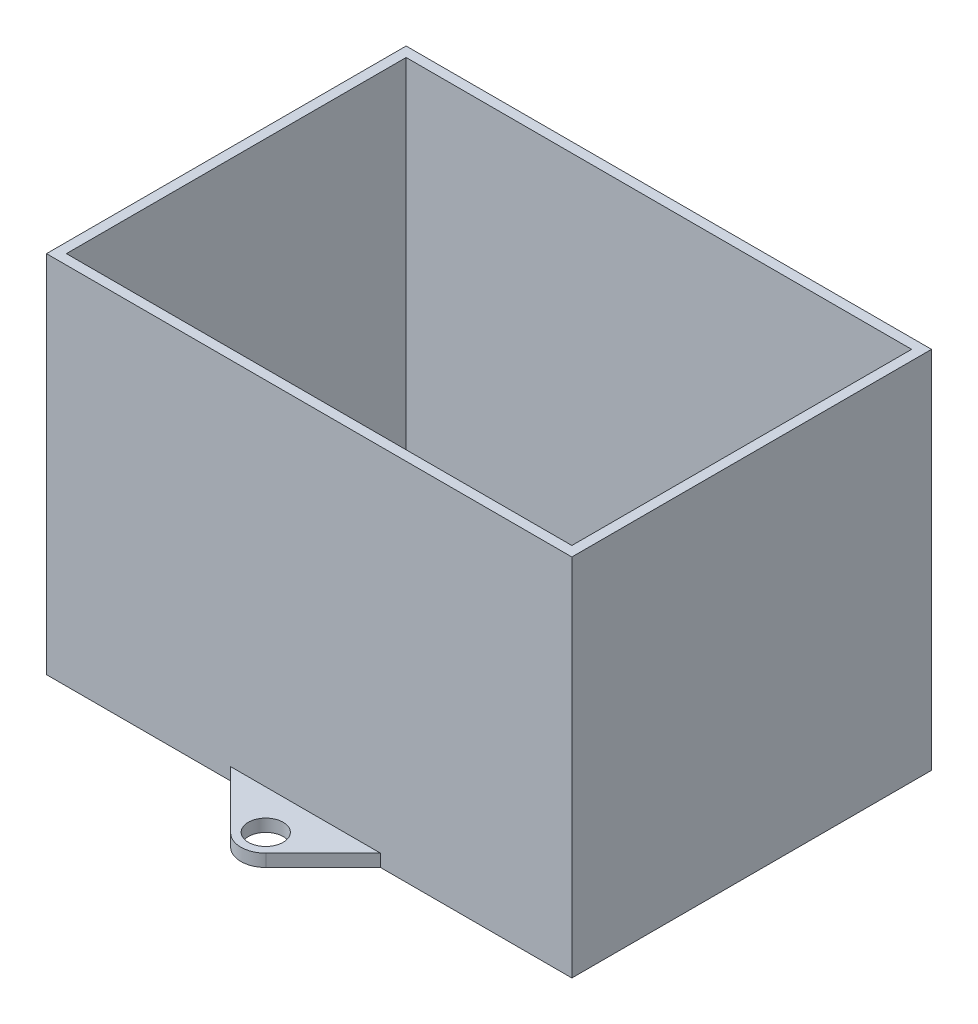
ISO-10303-21;
HEADER;
FILE_DESCRIPTION(('STEP AP214'),'2;1');
FILE_NAME('part.step','',(''),(''),'','','');
FILE_SCHEMA(('AUTOMOTIVE_DESIGN { 1 0 10303 214 1 1 1 1 }'));
ENDSEC;
DATA;
#1=APPLICATION_CONTEXT('core data for automotive mechanical design processes');
#2=APPLICATION_PROTOCOL_DEFINITION('international standard','automotive_design',2000,#1);
#3=PRODUCT_CONTEXT('',#1,'mechanical');
#4=PRODUCT('Part','Part','',(#3));
#5=PRODUCT_RELATED_PRODUCT_CATEGORY('part','',(#4));
#6=PRODUCT_DEFINITION_FORMATION('','',#4);
#7=PRODUCT_DEFINITION_CONTEXT('part definition',#1,'design');
#8=PRODUCT_DEFINITION('design','',#6,#7);
#9=PRODUCT_DEFINITION_SHAPE('','',#8);
#10=(LENGTH_UNIT() NAMED_UNIT(*) SI_UNIT(.MILLI.,.METRE.));
#11=(NAMED_UNIT(*) PLANE_ANGLE_UNIT() SI_UNIT($,.RADIAN.));
#12=(NAMED_UNIT(*) SI_UNIT($,.STERADIAN.) SOLID_ANGLE_UNIT());
#13=UNCERTAINTY_MEASURE_WITH_UNIT(LENGTH_MEASURE(1.E-05),#10,'distance_accuracy_value','');
#14=(GEOMETRIC_REPRESENTATION_CONTEXT(3) GLOBAL_UNCERTAINTY_ASSIGNED_CONTEXT((#13)) GLOBAL_UNIT_ASSIGNED_CONTEXT((#10,
#11,#12)) REPRESENTATION_CONTEXT('',''));
#15=CARTESIAN_POINT('',(0.,0.,0.));
#16=DIRECTION('',(0.,0.,1.));
#17=DIRECTION('',(1.,0.,0.));
#18=AXIS2_PLACEMENT_3D('',#15,#16,#17);
#19=CARTESIAN_POINT('',(0.,0.,0.));
#20=DIRECTION('',(0.,1.,0.));
#21=DIRECTION('',(0.,0.,1.));
#22=AXIS2_PLACEMENT_3D('',#19,#20,#21);
#23=PLANE('',#22);
#24=DIRECTION('',(0.,0.,-1.));
#25=VECTOR('',#24,1.);
#26=CARTESIAN_POINT('',(61.,0.,0.));
#27=LINE('',#26,#25);
#28=CARTESIAN_POINT('',(61.,0.,0.));
#29=VERTEX_POINT('',#28);
#30=CARTESIAN_POINT('',(61.,0.,-41.));
#31=VERTEX_POINT('',#30);
#32=EDGE_CURVE('E269',#29,#31,#27,.T.);
#33=ORIENTED_EDGE('',*,*,#32,.T.);
#34=DIRECTION('',(1.,0.,0.));
#35=VECTOR('',#34,1.);
#36=CARTESIAN_POINT('',(0.,0.,-41.));
#37=LINE('',#36,#35);
#38=CARTESIAN_POINT('',(0.,0.,-41.));
#39=VERTEX_POINT('',#38);
#40=EDGE_CURVE('E300',#39,#31,#37,.T.);
#41=ORIENTED_EDGE('',*,*,#40,.F.);
#42=DIRECTION('',(0.,0.,-1.));
#43=VECTOR('',#42,1.);
#44=CARTESIAN_POINT('',(0.,0.,0.));
#45=LINE('',#44,#43);
#46=CARTESIAN_POINT('',(0.,0.,0.));
#47=VERTEX_POINT('',#46);
#48=EDGE_CURVE('E298',#47,#39,#45,.T.);
#49=ORIENTED_EDGE('',*,*,#48,.F.);
#50=DIRECTION('',(1.,0.,0.));
#51=VECTOR('',#50,1.);
#52=CARTESIAN_POINT('',(0.,0.,0.));
#53=LINE('',#52,#51);
#54=EDGE_CURVE('E295',#47,#29,#53,.T.);
#55=ORIENTED_EDGE('',*,*,#54,.T.);
#56=EDGE_LOOP('',(#33,#41,#49,#55));
#57=FACE_BOUND('',#56,.T.);
#58=CARTESIAN_POINT('',(29.9999999999999,0.,5.93903508848857));
#59=DIRECTION('',(0.,1.,0.));
#60=DIRECTION('',(0.,0.,1.));
#61=AXIS2_PLACEMENT_3D('',#58,#59,#60);
#62=CIRCLE('',#61,2.1);
#63=CARTESIAN_POINT('',(29.9999999999999,0.,8.03903508848857));
#64=VERTEX_POINT('',#63);
#65=EDGE_CURVE('E628',#64,#64,#62,.T.);
#66=ORIENTED_EDGE('',*,*,#65,.T.);
#67=EDGE_LOOP('',(#66));
#68=FACE_BOUND('',#67,.T.);
#69=CARTESIAN_POINT('',(-19.4975103653291,0.,-43.5584039122733));
#70=DIRECTION('',(0.,1.,0.));
#71=DIRECTION('',(0.,0.,1.));
#72=AXIS2_PLACEMENT_3D('',#69,#70,#71);
#73=CIRCLE('',#72,2.1);
#74=CARTESIAN_POINT('',(-19.4975103653291,0.,-41.4584039122733));
#75=VERTEX_POINT('',#74);
#76=EDGE_CURVE('E378',#75,#75,#73,.T.);
#77=ORIENTED_EDGE('',*,*,#76,.T.);
#78=EDGE_LOOP('',(#77));
#79=FACE_BOUND('',#78,.T.);
#80=CARTESIAN_POINT('',(-19.4975103653291,0.,-43.5584039122733));
#81=DIRECTION('',(0.,1.,0.));
#82=DIRECTION('',(0.,0.,1.));
#83=AXIS2_PLACEMENT_3D('',#80,#81,#82);
#84=CIRCLE('',#83,3.);
#85=CARTESIAN_POINT('',(-21.618832238129,-1.14491749414469E-13,-45.6797227265917));
#86=VERTEX_POINT('',#85);
#87=CARTESIAN_POINT('',(-21.6188291796475,0.,-41.4370820394735));
#88=VERTEX_POINT('',#87);
#89=EDGE_CURVE('E208',#86,#88,#84,.T.);
#90=ORIENTED_EDGE('',*,*,#89,.F.);
#91=DIRECTION('',(0.707106271439455,0.,-0.707107290933272));
#92=VECTOR('',#91,1.);
#93=CARTESIAN_POINT('',(-33.649293067158,-2.16572091337908E-13,-33.6492445522485));
#94=LINE('',#93,#92);
#95=CARTESIAN_POINT('',(-13.1492922021107,-2.11744053343235E-13,-54.1492749738489));
#96=VERTEX_POINT('',#95);
#97=EDGE_CURVE('E374',#86,#96,#94,.T.);
#98=ORIENTED_EDGE('',*,*,#97,.T.);
#99=DIRECTION('',(-0.707107290933272,0.,-0.707106271439455));
#100=VECTOR('',#99,1.);
#101=CARTESIAN_POINT('',(-1.2,-2.08460794334806E-13,-42.2));
#102=LINE('',#101,#100);
#103=CARTESIAN_POINT('',(-1.2,-2.08460794334806E-13,-42.2));
#104=VERTEX_POINT('',#103);
#105=EDGE_CURVE('E231',#104,#96,#102,.T.);
#106=ORIENTED_EDGE('',*,*,#105,.F.);
#107=DIRECTION('',(1.,0.,0.));
#108=VECTOR('',#107,1.);
#109=CARTESIAN_POINT('',(0.,0.,-42.2));
#110=LINE('',#109,#108);
#111=CARTESIAN_POINT('',(62.2,0.,-42.2));
#112=VERTEX_POINT('',#111);
#113=EDGE_CURVE('E274',#104,#112,#110,.T.);
#114=ORIENTED_EDGE('',*,*,#113,.T.);
#115=DIRECTION('',(0.,0.,-1.));
#116=VECTOR('',#115,1.);
#117=CARTESIAN_POINT('',(62.2,0.,0.));
#118=LINE('',#117,#116);
#119=CARTESIAN_POINT('',(62.2,0.,1.2));
#120=VERTEX_POINT('',#119);
#121=EDGE_CURVE('E306',#120,#112,#118,.T.);
#122=ORIENTED_EDGE('',*,*,#121,.F.);
#123=DIRECTION('',(-1.,0.,0.));
#124=VECTOR('',#123,1.);
#125=CARTESIAN_POINT('',(0.,0.,1.2));
#126=LINE('',#125,#124);
#127=CARTESIAN_POINT('',(39.1035957075022,0.,1.2));
#128=VERTEX_POINT('',#127);
#129=EDGE_CURVE('E259',#120,#128,#126,.T.);
#130=ORIENTED_EDGE('',*,*,#129,.T.);
#131=DIRECTION('',(0.707106271439456,0.,-0.707107290933272));
#132=VECTOR('',#131,1.);
#133=CARTESIAN_POINT('',(20.1518260431803,0.,20.1517969886616));
#134=LINE('',#133,#132);
#135=CARTESIAN_POINT('',(32.1822868722094,0.,8.12131881431836));
#136=VERTEX_POINT('',#135);
#137=EDGE_CURVE('E262',#136,#128,#134,.T.);
#138=ORIENTED_EDGE('',*,*,#137,.F.);
#139=CARTESIAN_POINT('',(30.0609649994095,0.,6.00000000000001));
#140=DIRECTION('',(0.,1.,0.));
#141=DIRECTION('',(0.,0.,1.));
#142=AXIS2_PLACEMENT_3D('',#139,#140,#141);
#143=CIRCLE('',#142,3.);
#144=CARTESIAN_POINT('',(27.9396461850912,0.,8.12132187279983));
#145=VERTEX_POINT('',#144);
#146=EDGE_CURVE('E264',#145,#136,#143,.T.);
#147=ORIENTED_EDGE('',*,*,#146,.F.);
#148=DIRECTION('',(-0.707107290933272,0.,-0.707106271439455));
#149=VECTOR('',#148,1.);
#150=CARTESIAN_POINT('',(9.90914201471066,0.,-9.90915630154338));
#151=LINE('',#150,#149);
#152=CARTESIAN_POINT('',(21.018314333247,0.,1.2));
#153=VERTEX_POINT('',#152);
#154=EDGE_CURVE('E248',#145,#153,#151,.T.);
#155=ORIENTED_EDGE('',*,*,#154,.T.);
#156=DIRECTION('',(-1.,0.,0.));
#157=VECTOR('',#156,1.);
#158=CARTESIAN_POINT('',(0.,0.,1.2));
#159=LINE('',#158,#157);
#160=CARTESIAN_POINT('',(-1.2,0.,1.2));
#161=VERTEX_POINT('',#160);
#162=EDGE_CURVE('E256',#153,#161,#159,.T.);
#163=ORIENTED_EDGE('',*,*,#162,.T.);
#164=DIRECTION('',(0.,0.,-1.));
#165=VECTOR('',#164,1.);
#166=CARTESIAN_POINT('',(-1.2,0.,0.));
#167=LINE('',#166,#165);
#168=CARTESIAN_POINT('',(-1.2,0.,-21.0182822993048));
#169=VERTEX_POINT('',#168);
#170=EDGE_CURVE('E303',#161,#169,#167,.T.);
#171=ORIENTED_EDGE('',*,*,#170,.T.);
#172=DIRECTION('',(-0.707107290933272,0.,-0.707106271439455));
#173=VECTOR('',#172,1.);
#174=CARTESIAN_POINT('',(9.90914201471066,0.,-9.90915630154338));
#175=LINE('',#174,#173);
#176=EDGE_CURVE('E227',#169,#88,#175,.T.);
#177=ORIENTED_EDGE('',*,*,#176,.T.);
#178=EDGE_LOOP('',(#90,#98,#106,#114,#122,#130,#138,#147,#155,#163,#171,#177));
#179=FACE_BOUND('',#178,.T.);
#180=ADVANCED_FACE('F91',(#57,#68,#79,#179),#23,.F.);
#181=CARTESIAN_POINT('',(-27.2,1.4999999999994,0.));
#182=DIRECTION('',(0.,1.,0.));
#183=DIRECTION('',(0.,0.,1.));
#184=AXIS2_PLACEMENT_3D('',#181,#182,#183);
#185=PLANE('',#184);
#186=CARTESIAN_POINT('',(-19.4975103653291,1.5,-43.5584039122733));
#187=DIRECTION('',(0.,1.,0.));
#188=DIRECTION('',(0.,0.,1.));
#189=AXIS2_PLACEMENT_3D('',#186,#187,#188);
#190=CIRCLE('',#189,2.1);
#191=CARTESIAN_POINT('',(-19.4975103653291,1.5,-41.4584039122733));
#192=VERTEX_POINT('',#191);
#193=EDGE_CURVE('E222',#192,#192,#190,.T.);
#194=ORIENTED_EDGE('',*,*,#193,.F.);
#195=EDGE_LOOP('',(#194));
#196=FACE_BOUND('',#195,.T.);
#197=DIRECTION('',(0.707106271439455,0.,-0.707107290933272));
#198=VECTOR('',#197,1.);
#199=CARTESIAN_POINT('',(-33.649293067158,1.4999999999995,-33.6492445522485));
#200=LINE('',#199,#198);
#201=CARTESIAN_POINT('',(-21.618832238129,1.49999999999962,-45.6797227265917));
#202=VERTEX_POINT('',#201);
#203=CARTESIAN_POINT('',(-13.1492922021107,1.4999999999997,-54.1492749738489));
#204=VERTEX_POINT('',#203);
#205=EDGE_CURVE('E221',#202,#204,#200,.T.);
#206=ORIENTED_EDGE('',*,*,#205,.F.);
#207=CARTESIAN_POINT('',(-19.4975103653291,1.5000000000068,-43.5584039122733));
#208=DIRECTION('',(0.,1.,0.));
#209=DIRECTION('',(0.,0.,1.));
#210=AXIS2_PLACEMENT_3D('',#207,#208,#209);
#211=CIRCLE('',#210,3.);
#212=CARTESIAN_POINT('',(-21.6188291796475,1.5000000000068,-41.4370820394735));
#213=VERTEX_POINT('',#212);
#214=EDGE_CURVE('E106',#202,#213,#211,.T.);
#215=ORIENTED_EDGE('',*,*,#214,.T.);
#216=DIRECTION('',(-0.707107290933272,0.,-0.707106271439455));
#217=VECTOR('',#216,1.);
#218=CARTESIAN_POINT('',(9.90914201471066,1.49999999999948,-9.90915630154336));
#219=LINE('',#218,#217);
#220=CARTESIAN_POINT('',(-1.2,1.49999999999961,-21.0182822993048));
#221=VERTEX_POINT('',#220);
#222=EDGE_CURVE('E218',#221,#213,#219,.T.);
#223=ORIENTED_EDGE('',*,*,#222,.F.);
#224=DIRECTION('',(0.,0.,1.));
#225=VECTOR('',#224,1.);
#226=CARTESIAN_POINT('',(-1.2,1.4999999999994,0.));
#227=LINE('',#226,#225);
#228=CARTESIAN_POINT('',(-1.20000000000001,1.4999999999997,-42.2));
#229=VERTEX_POINT('',#228);
#230=EDGE_CURVE('E236',#229,#221,#227,.T.);
#231=ORIENTED_EDGE('',*,*,#230,.F.);
#232=DIRECTION('',(-0.707107290933272,0.,-0.707106271439455));
#233=VECTOR('',#232,1.);
#234=CARTESIAN_POINT('',(-1.20000000000001,1.4999999999997,-42.2));
#235=LINE('',#234,#233);
#236=EDGE_CURVE('E228',#229,#204,#235,.T.);
#237=ORIENTED_EDGE('',*,*,#236,.T.);
#238=EDGE_LOOP('',(#206,#215,#223,#231,#237));
#239=FACE_BOUND('',#238,.T.);
#240=ADVANCED_FACE('F216',(#196,#239),#185,.T.);
#241=CARTESIAN_POINT('',(9.90914201471066,-24.5000000000005,-9.90915630154356));
#242=DIRECTION('',(0.707106271439455,0.,-0.707107290933272));
#243=DIRECTION('',(-0.707107290933272,0.,-0.707106271439455));
#244=AXIS2_PLACEMENT_3D('',#241,#242,#243);
#245=PLANE('',#244);
#246=DIRECTION('',(0.,1.,0.));
#247=VECTOR('',#246,1.);
#248=CARTESIAN_POINT('',(-21.6188291796475,-24.4999999999932,-41.4370820394735));
#249=LINE('',#248,#247);
#250=EDGE_CURVE('E205',#88,#213,#249,.T.);
#251=ORIENTED_EDGE('',*,*,#250,.F.);
#252=ORIENTED_EDGE('',*,*,#176,.F.);
#253=DIRECTION('',(0.,1.,0.));
#254=VECTOR('',#253,1.);
#255=CARTESIAN_POINT('',(-1.2,0.,-21.0182822993048));
#256=LINE('',#255,#254);
#257=EDGE_CURVE('E226',#169,#221,#256,.T.);
#258=ORIENTED_EDGE('',*,*,#257,.T.);
#259=ORIENTED_EDGE('',*,*,#222,.T.);
#260=EDGE_LOOP('',(#251,#252,#258,#259));
#261=FACE_BOUND('',#260,.T.);
#262=ADVANCED_FACE('F224',(#261),#245,.F.);
#263=CARTESIAN_POINT('',(-33.649293067158,0.,-33.6492445522485));
#264=DIRECTION('',(-0.707107290933272,0.,-0.707106271439455));
#265=DIRECTION('',(-0.707106271439455,0.,0.707107290933272));
#266=AXIS2_PLACEMENT_3D('',#263,#264,#265);
#267=PLANE('',#266);
#268=ORIENTED_EDGE('',*,*,#97,.F.);
#269=DIRECTION('',(0.,1.,0.));
#270=VECTOR('',#269,1.);
#271=CARTESIAN_POINT('',(-21.618832238129,-24.4999999999932,-45.6797227265916));
#272=LINE('',#271,#270);
#273=EDGE_CURVE('E12',#86,#202,#272,.T.);
#274=ORIENTED_EDGE('',*,*,#273,.T.);
#275=ORIENTED_EDGE('',*,*,#205,.T.);
#276=DIRECTION('',(0.,1.,0.));
#277=VECTOR('',#276,1.);
#278=CARTESIAN_POINT('',(-13.1492922021107,0.,-54.1492749738489));
#279=LINE('',#278,#277);
#280=EDGE_CURVE('E380',#96,#204,#279,.T.);
#281=ORIENTED_EDGE('',*,*,#280,.F.);
#282=EDGE_LOOP('',(#268,#274,#275,#281));
#283=FACE_BOUND('',#282,.T.);
#284=ADVANCED_FACE('F388',(#283),#267,.T.);
#285=CARTESIAN_POINT('',(0.,44.,-42.2));
#286=DIRECTION('',(0.,0.,-1.));
#287=DIRECTION('',(-1.,0.,0.));
#288=AXIS2_PLACEMENT_3D('',#285,#286,#287);
#289=PLANE('',#288);
#290=ORIENTED_EDGE('',*,*,#113,.F.);
#291=DIRECTION('',(0.,1.,0.));
#292=VECTOR('',#291,1.);
#293=CARTESIAN_POINT('',(-1.2,0.,-42.2));
#294=LINE('',#293,#292);
#295=EDGE_CURVE('E370',#104,#229,#294,.T.);
#296=ORIENTED_EDGE('',*,*,#295,.T.);
#297=DIRECTION('',(0.,-1.,0.));
#298=VECTOR('',#297,1.);
#299=CARTESIAN_POINT('',(-1.2,44.,-42.2));
#300=LINE('',#299,#298);
#301=CARTESIAN_POINT('',(-1.2,44.,-42.2));
#302=VERTEX_POINT('',#301);
#303=EDGE_CURVE('E310',#302,#229,#300,.T.);
#304=ORIENTED_EDGE('',*,*,#303,.F.);
#305=DIRECTION('',(1.,0.,0.));
#306=VECTOR('',#305,1.);
#307=CARTESIAN_POINT('',(0.,44.,-42.2));
#308=LINE('',#307,#306);
#309=CARTESIAN_POINT('',(62.2,44.,-42.2));
#310=VERTEX_POINT('',#309);
#311=EDGE_CURVE('E289',#302,#310,#308,.T.);
#312=ORIENTED_EDGE('',*,*,#311,.T.);
#313=DIRECTION('',(0.,-1.,0.));
#314=VECTOR('',#313,1.);
#315=CARTESIAN_POINT('',(62.2,44.,-42.2));
#316=LINE('',#315,#314);
#317=EDGE_CURVE('E313',#310,#112,#316,.T.);
#318=ORIENTED_EDGE('',*,*,#317,.T.);
#319=EDGE_LOOP('',(#290,#296,#304,#312,#318));
#320=FACE_BOUND('',#319,.T.);
#321=ADVANCED_FACE('F367',(#320),#289,.T.);
#322=CARTESIAN_POINT('',(-1.2,44.,0.));
#323=DIRECTION('',(-1.,0.,0.));
#324=DIRECTION('',(0.,0.,1.));
#325=AXIS2_PLACEMENT_3D('',#322,#323,#324);
#326=PLANE('',#325);
#327=ORIENTED_EDGE('',*,*,#303,.T.);
#328=ORIENTED_EDGE('',*,*,#230,.T.);
#329=ORIENTED_EDGE('',*,*,#257,.F.);
#330=ORIENTED_EDGE('',*,*,#170,.F.);
#331=DIRECTION('',(0.,-1.,0.));
#332=VECTOR('',#331,1.);
#333=CARTESIAN_POINT('',(-1.2,44.,1.2));
#334=LINE('',#333,#332);
#335=CARTESIAN_POINT('',(-1.2,44.,1.2));
#336=VERTEX_POINT('',#335);
#337=EDGE_CURVE('E99',#336,#161,#334,.T.);
#338=ORIENTED_EDGE('',*,*,#337,.F.);
#339=DIRECTION('',(0.,0.,-1.));
#340=VECTOR('',#339,1.);
#341=CARTESIAN_POINT('',(-1.2,44.,0.));
#342=LINE('',#341,#340);
#343=EDGE_CURVE('E281',#336,#302,#342,.T.);
#344=ORIENTED_EDGE('',*,*,#343,.T.);
#345=EDGE_LOOP('',(#327,#328,#329,#330,#338,#344));
#346=FACE_BOUND('',#345,.T.);
#347=ADVANCED_FACE('F355',(#346),#326,.T.);
#348=CARTESIAN_POINT('',(0.,1.5,0.));
#349=DIRECTION('',(0.,1.,0.));
#350=DIRECTION('',(0.,0.,1.));
#351=AXIS2_PLACEMENT_3D('',#348,#349,#350);
#352=PLANE('',#351);
#353=CARTESIAN_POINT('',(29.9999999999999,1.5,5.93903508848857));
#354=DIRECTION('',(0.,1.,0.));
#355=DIRECTION('',(0.,0.,1.));
#356=AXIS2_PLACEMENT_3D('',#353,#354,#355);
#357=CIRCLE('',#356,2.1);
#358=CARTESIAN_POINT('',(29.9999999999999,1.5,8.03903508848857));
#359=VERTEX_POINT('',#358);
#360=EDGE_CURVE('E633',#359,#359,#357,.T.);
#361=ORIENTED_EDGE('',*,*,#360,.F.);
#362=EDGE_LOOP('',(#361));
#363=FACE_BOUND('',#362,.T.);
#364=CARTESIAN_POINT('',(30.0609649994095,1.5,6.00000000000001));
#365=DIRECTION('',(0.,1.,0.));
#366=DIRECTION('',(0.,0.,1.));
#367=AXIS2_PLACEMENT_3D('',#364,#365,#366);
#368=CIRCLE('',#367,3.);
#369=CARTESIAN_POINT('',(27.9396461850912,1.5,8.12132187279984));
#370=VERTEX_POINT('',#369);
#371=CARTESIAN_POINT('',(32.1822868722094,1.5,8.12131881431836));
#372=VERTEX_POINT('',#371);
#373=EDGE_CURVE('E113',#370,#372,#368,.T.);
#374=ORIENTED_EDGE('',*,*,#373,.T.);
#375=DIRECTION('',(0.707106271439456,0.,-0.707107290933272));
#376=VECTOR('',#375,1.);
#377=CARTESIAN_POINT('',(20.1518260431803,1.5,20.1517969886616));
#378=LINE('',#377,#376);
#379=CARTESIAN_POINT('',(39.1035957075022,1.5,1.2));
#380=VERTEX_POINT('',#379);
#381=EDGE_CURVE('E242',#372,#380,#378,.T.);
#382=ORIENTED_EDGE('',*,*,#381,.T.);
#383=DIRECTION('',(1.,0.,0.));
#384=VECTOR('',#383,1.);
#385=CARTESIAN_POINT('',(-1.2,1.5,1.2));
#386=LINE('',#385,#384);
#387=CARTESIAN_POINT('',(21.018314333247,1.5,1.2));
#388=VERTEX_POINT('',#387);
#389=EDGE_CURVE('E266',#388,#380,#386,.T.);
#390=ORIENTED_EDGE('',*,*,#389,.F.);
#391=DIRECTION('',(-0.707107290933272,0.,-0.707106271439455));
#392=VECTOR('',#391,1.);
#393=CARTESIAN_POINT('',(9.90914201471066,1.5,-9.90915630154338));
#394=LINE('',#393,#392);
#395=EDGE_CURVE('E239',#370,#388,#394,.T.);
#396=ORIENTED_EDGE('',*,*,#395,.F.);
#397=EDGE_LOOP('',(#374,#382,#390,#396));
#398=FACE_BOUND('',#397,.T.);
#399=ADVANCED_FACE('F396',(#363,#398),#352,.T.);
#400=CARTESIAN_POINT('',(0.,44.,1.2));
#401=DIRECTION('',(0.,0.,-1.));
#402=DIRECTION('',(-1.,0.,0.));
#403=AXIS2_PLACEMENT_3D('',#400,#401,#402);
#404=PLANE('',#403);
#405=ORIENTED_EDGE('',*,*,#337,.T.);
#406=ORIENTED_EDGE('',*,*,#162,.F.);
#407=DIRECTION('',(0.,1.,0.));
#408=VECTOR('',#407,1.);
#409=CARTESIAN_POINT('',(21.018314333247,-8.5,1.2));
#410=LINE('',#409,#408);
#411=EDGE_CURVE('E251',#153,#388,#410,.T.);
#412=ORIENTED_EDGE('',*,*,#411,.T.);
#413=ORIENTED_EDGE('',*,*,#389,.T.);
#414=DIRECTION('',(0.,1.,0.));
#415=VECTOR('',#414,1.);
#416=CARTESIAN_POINT('',(39.1035957075022,-8.5,1.2));
#417=LINE('',#416,#415);
#418=EDGE_CURVE('E249',#128,#380,#417,.T.);
#419=ORIENTED_EDGE('',*,*,#418,.F.);
#420=ORIENTED_EDGE('',*,*,#129,.F.);
#421=DIRECTION('',(0.,-1.,0.));
#422=VECTOR('',#421,1.);
#423=CARTESIAN_POINT('',(62.2,44.,1.2));
#424=LINE('',#423,#422);
#425=CARTESIAN_POINT('',(62.2,44.,1.2));
#426=VERTEX_POINT('',#425);
#427=EDGE_CURVE('E317',#426,#120,#424,.T.);
#428=ORIENTED_EDGE('',*,*,#427,.F.);
#429=DIRECTION('',(1.,0.,0.));
#430=VECTOR('',#429,1.);
#431=CARTESIAN_POINT('',(0.,44.,1.2));
#432=LINE('',#431,#430);
#433=EDGE_CURVE('E284',#336,#426,#432,.T.);
#434=ORIENTED_EDGE('',*,*,#433,.F.);
#435=EDGE_LOOP('',(#405,#406,#412,#413,#419,#420,#428,#434));
#436=FACE_BOUND('',#435,.T.);
#437=ADVANCED_FACE('F358',(#436),#404,.F.);
#438=CARTESIAN_POINT('',(62.2,44.,0.));
#439=DIRECTION('',(-1.,0.,0.));
#440=DIRECTION('',(0.,0.,1.));
#441=AXIS2_PLACEMENT_3D('',#438,#439,#440);
#442=PLANE('',#441);
#443=ORIENTED_EDGE('',*,*,#427,.T.);
#444=ORIENTED_EDGE('',*,*,#121,.T.);
#445=ORIENTED_EDGE('',*,*,#317,.F.);
#446=DIRECTION('',(0.,0.,-1.));
#447=VECTOR('',#446,1.);
#448=CARTESIAN_POINT('',(62.2,44.,0.));
#449=LINE('',#448,#447);
#450=EDGE_CURVE('E287',#426,#310,#449,.T.);
#451=ORIENTED_EDGE('',*,*,#450,.F.);
#452=EDGE_LOOP('',(#443,#444,#445,#451));
#453=FACE_BOUND('',#452,.T.);
#454=ADVANCED_FACE('F363',(#453),#442,.F.);
#455=CARTESIAN_POINT('',(61.,44.,0.));
#456=DIRECTION('',(-1.,0.,0.));
#457=DIRECTION('',(0.,0.,1.));
#458=AXIS2_PLACEMENT_3D('',#455,#456,#457);
#459=PLANE('',#458);
#460=ORIENTED_EDGE('',*,*,#32,.F.);
#461=DIRECTION('',(0.,-1.,0.));
#462=VECTOR('',#461,1.);
#463=CARTESIAN_POINT('',(61.,44.,0.));
#464=LINE('',#463,#462);
#465=CARTESIAN_POINT('',(61.,44.,0.));
#466=VERTEX_POINT('',#465);
#467=EDGE_CURVE('E314',#466,#29,#464,.T.);
#468=ORIENTED_EDGE('',*,*,#467,.F.);
#469=DIRECTION('',(0.,0.,-1.));
#470=VECTOR('',#469,1.);
#471=CARTESIAN_POINT('',(61.,44.,0.));
#472=LINE('',#471,#470);
#473=CARTESIAN_POINT('',(61.,44.,-41.));
#474=VERTEX_POINT('',#473);
#475=EDGE_CURVE('E270',#466,#474,#472,.T.);
#476=ORIENTED_EDGE('',*,*,#475,.T.);
#477=DIRECTION('',(0.,-1.,0.));
#478=VECTOR('',#477,1.);
#479=CARTESIAN_POINT('',(61.,44.,-41.));
#480=LINE('',#479,#478);
#481=EDGE_CURVE('E292',#474,#31,#480,.T.);
#482=ORIENTED_EDGE('',*,*,#481,.T.);
#483=EDGE_LOOP('',(#460,#468,#476,#482));
#484=FACE_BOUND('',#483,.T.);
#485=ADVANCED_FACE('F93',(#484),#459,.T.);
#486=CARTESIAN_POINT('',(0.,44.,0.));
#487=DIRECTION('',(0.,0.,-1.));
#488=DIRECTION('',(-1.,0.,0.));
#489=AXIS2_PLACEMENT_3D('',#486,#487,#488);
#490=PLANE('',#489);
#491=ORIENTED_EDGE('',*,*,#54,.F.);
#492=DIRECTION('',(0.,-1.,0.));
#493=VECTOR('',#492,1.);
#494=CARTESIAN_POINT('',(0.,44.,0.));
#495=LINE('',#494,#493);
#496=CARTESIAN_POINT('',(0.,44.,0.));
#497=VERTEX_POINT('',#496);
#498=EDGE_CURVE('E324',#497,#47,#495,.T.);
#499=ORIENTED_EDGE('',*,*,#498,.F.);
#500=DIRECTION('',(1.,0.,0.));
#501=VECTOR('',#500,1.);
#502=CARTESIAN_POINT('',(0.,44.,0.));
#503=LINE('',#502,#501);
#504=EDGE_CURVE('E273',#497,#466,#503,.T.);
#505=ORIENTED_EDGE('',*,*,#504,.T.);
#506=ORIENTED_EDGE('',*,*,#467,.T.);
#507=EDGE_LOOP('',(#491,#499,#505,#506));
#508=FACE_BOUND('',#507,.T.);
#509=ADVANCED_FACE('F328',(#508),#490,.T.);
#510=CARTESIAN_POINT('',(0.,44.,0.));
#511=DIRECTION('',(-1.,0.,0.));
#512=DIRECTION('',(0.,0.,1.));
#513=AXIS2_PLACEMENT_3D('',#510,#511,#512);
#514=PLANE('',#513);
#515=ORIENTED_EDGE('',*,*,#48,.T.);
#516=DIRECTION('',(0.,-1.,0.));
#517=VECTOR('',#516,1.);
#518=CARTESIAN_POINT('',(0.,44.,-41.));
#519=LINE('',#518,#517);
#520=CARTESIAN_POINT('',(0.,44.,-41.));
#521=VERTEX_POINT('',#520);
#522=EDGE_CURVE('E321',#521,#39,#519,.T.);
#523=ORIENTED_EDGE('',*,*,#522,.F.);
#524=DIRECTION('',(0.,0.,-1.));
#525=VECTOR('',#524,1.);
#526=CARTESIAN_POINT('',(0.,44.,0.));
#527=LINE('',#526,#525);
#528=EDGE_CURVE('E277',#497,#521,#527,.T.);
#529=ORIENTED_EDGE('',*,*,#528,.F.);
#530=ORIENTED_EDGE('',*,*,#498,.T.);
#531=EDGE_LOOP('',(#515,#523,#529,#530));
#532=FACE_BOUND('',#531,.T.);
#533=ADVANCED_FACE('F339',(#532),#514,.F.);
#534=CARTESIAN_POINT('',(0.,44.,-41.));
#535=DIRECTION('',(0.,0.,-1.));
#536=DIRECTION('',(-1.,0.,0.));
#537=AXIS2_PLACEMENT_3D('',#534,#535,#536);
#538=PLANE('',#537);
#539=ORIENTED_EDGE('',*,*,#40,.T.);
#540=ORIENTED_EDGE('',*,*,#481,.F.);
#541=DIRECTION('',(1.,0.,0.));
#542=VECTOR('',#541,1.);
#543=CARTESIAN_POINT('',(0.,44.,-41.));
#544=LINE('',#543,#542);
#545=EDGE_CURVE('E279',#521,#474,#544,.T.);
#546=ORIENTED_EDGE('',*,*,#545,.F.);
#547=ORIENTED_EDGE('',*,*,#522,.T.);
#548=EDGE_LOOP('',(#539,#540,#546,#547));
#549=FACE_BOUND('',#548,.T.);
#550=ADVANCED_FACE('F343',(#549),#538,.F.);
#551=CARTESIAN_POINT('',(0.,44.,0.));
#552=DIRECTION('',(0.,1.,0.));
#553=DIRECTION('',(0.,0.,1.));
#554=AXIS2_PLACEMENT_3D('',#551,#552,#553);
#555=PLANE('',#554);
#556=ORIENTED_EDGE('',*,*,#475,.F.);
#557=ORIENTED_EDGE('',*,*,#504,.F.);
#558=ORIENTED_EDGE('',*,*,#528,.T.);
#559=ORIENTED_EDGE('',*,*,#545,.T.);
#560=EDGE_LOOP('',(#556,#557,#558,#559));
#561=FACE_BOUND('',#560,.T.);
#562=ORIENTED_EDGE('',*,*,#343,.F.);
#563=ORIENTED_EDGE('',*,*,#433,.T.);
#564=ORIENTED_EDGE('',*,*,#450,.T.);
#565=ORIENTED_EDGE('',*,*,#311,.F.);
#566=EDGE_LOOP('',(#562,#563,#564,#565));
#567=FACE_BOUND('',#566,.T.);
#568=ADVANCED_FACE('F345',(#561,#567),#555,.T.);
#569=CARTESIAN_POINT('',(30.0609649994095,-8.5,6.00000000000001));
#570=DIRECTION('',(0.,1.,0.));
#571=DIRECTION('',(0.,0.,1.));
#572=AXIS2_PLACEMENT_3D('',#569,#570,#571);
#573=CYLINDRICAL_SURFACE('',#572,3.);
#574=ORIENTED_EDGE('',*,*,#146,.T.);
#575=DIRECTION('',(0.,1.,0.));
#576=VECTOR('',#575,1.);
#577=CARTESIAN_POINT('',(32.1822868722094,-8.5,8.12131881431836));
#578=LINE('',#577,#576);
#579=EDGE_CURVE('E246',#136,#372,#578,.T.);
#580=ORIENTED_EDGE('',*,*,#579,.T.);
#581=ORIENTED_EDGE('',*,*,#373,.F.);
#582=DIRECTION('',(0.,1.,0.));
#583=VECTOR('',#582,1.);
#584=CARTESIAN_POINT('',(27.9396461850912,-8.5,8.12132187279983));
#585=LINE('',#584,#583);
#586=EDGE_CURVE('E245',#145,#370,#585,.T.);
#587=ORIENTED_EDGE('',*,*,#586,.F.);
#588=EDGE_LOOP('',(#574,#580,#581,#587));
#589=FACE_BOUND('',#588,.T.);
#590=ADVANCED_FACE('F348',(#589),#573,.T.);
#591=CARTESIAN_POINT('',(20.1518260431803,-8.5,20.1517969886616));
#592=DIRECTION('',(0.707107290933272,0.,0.707106271439456));
#593=DIRECTION('',(0.707106271439456,0.,-0.707107290933272));
#594=AXIS2_PLACEMENT_3D('',#591,#592,#593);
#595=PLANE('',#594);
#596=ORIENTED_EDGE('',*,*,#137,.T.);
#597=ORIENTED_EDGE('',*,*,#418,.T.);
#598=ORIENTED_EDGE('',*,*,#381,.F.);
#599=ORIENTED_EDGE('',*,*,#579,.F.);
#600=EDGE_LOOP('',(#596,#597,#598,#599));
#601=FACE_BOUND('',#600,.T.);
#602=ADVANCED_FACE('F401',(#601),#595,.T.);
#603=CARTESIAN_POINT('',(9.90914201471066,-8.5,-9.90915630154338));
#604=DIRECTION('',(0.707106271439455,0.,-0.707107290933272));
#605=DIRECTION('',(-0.707107290933272,0.,-0.707106271439455));
#606=AXIS2_PLACEMENT_3D('',#603,#604,#605);
#607=PLANE('',#606);
#608=ORIENTED_EDGE('',*,*,#586,.T.);
#609=ORIENTED_EDGE('',*,*,#395,.T.);
#610=ORIENTED_EDGE('',*,*,#411,.F.);
#611=ORIENTED_EDGE('',*,*,#154,.F.);
#612=EDGE_LOOP('',(#608,#609,#610,#611));
#613=FACE_BOUND('',#612,.T.);
#614=ADVANCED_FACE('F392',(#613),#607,.F.);
#615=CARTESIAN_POINT('',(-1.2,0.,-42.2));
#616=DIRECTION('',(-0.707106271439455,0.,0.707107290933272));
#617=DIRECTION('',(0.707107290933272,0.,0.707106271439455));
#618=AXIS2_PLACEMENT_3D('',#615,#616,#617);
#619=PLANE('',#618);
#620=ORIENTED_EDGE('',*,*,#280,.T.);
#621=ORIENTED_EDGE('',*,*,#236,.F.);
#622=ORIENTED_EDGE('',*,*,#295,.F.);
#623=ORIENTED_EDGE('',*,*,#105,.T.);
#624=EDGE_LOOP('',(#620,#621,#622,#623));
#625=FACE_BOUND('',#624,.T.);
#626=ADVANCED_FACE('F387',(#625),#619,.F.);
#627=CARTESIAN_POINT('',(-19.4975103653291,-24.4999999999932,-43.5584039122733));
#628=DIRECTION('',(0.,1.,0.));
#629=DIRECTION('',(0.,0.,1.));
#630=AXIS2_PLACEMENT_3D('',#627,#628,#629);
#631=CYLINDRICAL_SURFACE('',#630,3.);
#632=ORIENTED_EDGE('',*,*,#89,.T.);
#633=ORIENTED_EDGE('',*,*,#250,.T.);
#634=ORIENTED_EDGE('',*,*,#214,.F.);
#635=ORIENTED_EDGE('',*,*,#273,.F.);
#636=EDGE_LOOP('',(#632,#633,#634,#635));
#637=FACE_BOUND('',#636,.T.);
#638=ADVANCED_FACE('F206',(#637),#631,.T.);
#639=CARTESIAN_POINT('',(29.9999999999999,-24.5,5.93903508848857));
#640=DIRECTION('',(0.,1.,0.));
#641=DIRECTION('',(0.,0.,1.));
#642=AXIS2_PLACEMENT_3D('',#639,#640,#641);
#643=CYLINDRICAL_SURFACE('',#642,2.1);
#644=ORIENTED_EDGE('',*,*,#360,.T.);
#645=EDGE_LOOP('',(#644));
#646=FACE_BOUND('',#645,.T.);
#647=ORIENTED_EDGE('',*,*,#65,.F.);
#648=EDGE_LOOP('',(#647));
#649=FACE_BOUND('',#648,.T.);
#650=ADVANCED_FACE('F600',(#646,#649),#643,.F.);
#651=CARTESIAN_POINT('',(-19.4975103653291,-24.5,-43.5584039122733));
#652=DIRECTION('',(0.,1.,0.));
#653=DIRECTION('',(0.,0.,1.));
#654=AXIS2_PLACEMENT_3D('',#651,#652,#653);
#655=CYLINDRICAL_SURFACE('',#654,2.1);
#656=ORIENTED_EDGE('',*,*,#193,.T.);
#657=EDGE_LOOP('',(#656));
#658=FACE_BOUND('',#657,.T.);
#659=ORIENTED_EDGE('',*,*,#76,.F.);
#660=EDGE_LOOP('',(#659));
#661=FACE_BOUND('',#660,.T.);
#662=ADVANCED_FACE('F609',(#658,#661),#655,.F.);
#663=CLOSED_SHELL('',(#180,#240,#262,#284,#321,#347,#399,#437,#454,#485,#509,#533,#550,#568,
#590,#602,#614,#626,#638,#650,#662));
#664=MANIFOLD_SOLID_BREP('B2',#663);
#665=ADVANCED_BREP_SHAPE_REPRESENTATION('',(#18,#664),#14);
#666=SHAPE_DEFINITION_REPRESENTATION(#9,#665);
ENDSEC;
END-ISO-10303-21;
